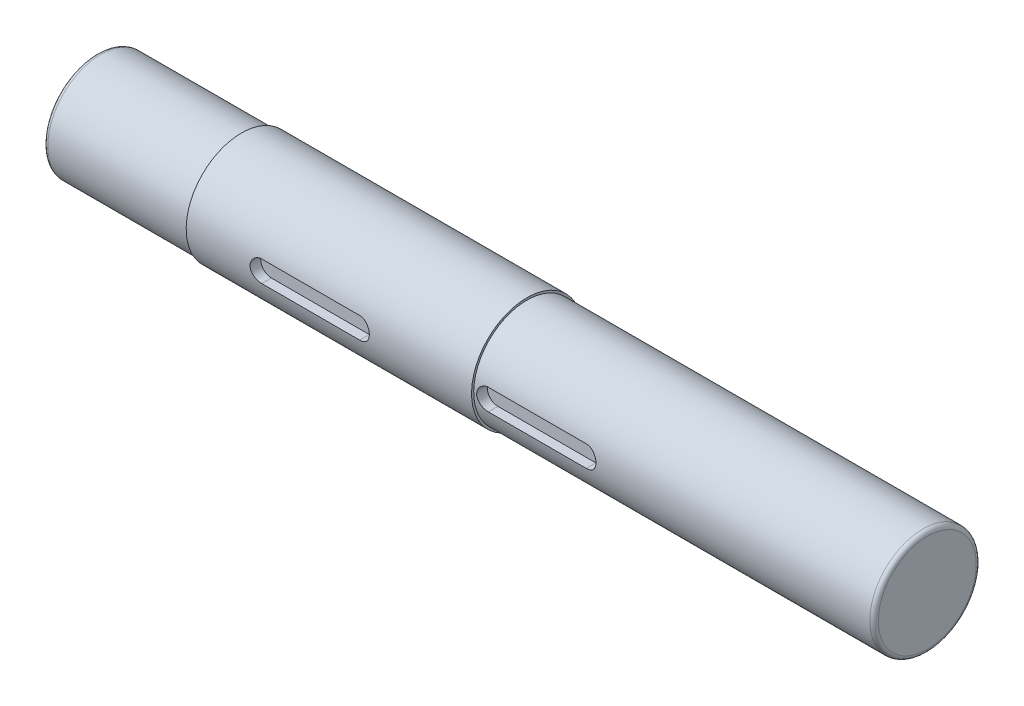
ISO-10303-21;
HEADER;
FILE_DESCRIPTION(('STEP AP214'),'2;1');
FILE_NAME('part.step','',(''),(''),'','','');
FILE_SCHEMA(('AUTOMOTIVE_DESIGN { 1 0 10303 214 1 1 1 1 }'));
ENDSEC;
DATA;
#1=APPLICATION_CONTEXT('core data for automotive mechanical design processes');
#2=APPLICATION_PROTOCOL_DEFINITION('international standard','automotive_design',2000,#1);
#3=PRODUCT_CONTEXT('',#1,'mechanical');
#4=PRODUCT('Part','Part','',(#3));
#5=PRODUCT_RELATED_PRODUCT_CATEGORY('part','',(#4));
#6=PRODUCT_DEFINITION_FORMATION('','',#4);
#7=PRODUCT_DEFINITION_CONTEXT('part definition',#1,'design');
#8=PRODUCT_DEFINITION('design','',#6,#7);
#9=PRODUCT_DEFINITION_SHAPE('','',#8);
#10=(LENGTH_UNIT() NAMED_UNIT(*) SI_UNIT(.MILLI.,.METRE.));
#11=(NAMED_UNIT(*) PLANE_ANGLE_UNIT() SI_UNIT($,.RADIAN.));
#12=(NAMED_UNIT(*) SI_UNIT($,.STERADIAN.) SOLID_ANGLE_UNIT());
#13=UNCERTAINTY_MEASURE_WITH_UNIT(LENGTH_MEASURE(1.E-05),#10,'distance_accuracy_value','');
#14=(GEOMETRIC_REPRESENTATION_CONTEXT(3) GLOBAL_UNCERTAINTY_ASSIGNED_CONTEXT((#13)) GLOBAL_UNIT_ASSIGNED_CONTEXT((#10,
#11,#12)) REPRESENTATION_CONTEXT('',''));
#15=CARTESIAN_POINT('',(0.,0.,0.));
#16=DIRECTION('',(0.,0.,1.));
#17=DIRECTION('',(1.,0.,0.));
#18=AXIS2_PLACEMENT_3D('',#15,#16,#17);
#19=CARTESIAN_POINT('',(16.7770559989917,0.,0.));
#20=DIRECTION('',(1.,0.,0.));
#21=DIRECTION('',(0.,1.,0.));
#22=AXIS2_PLACEMENT_3D('',#19,#20,#21);
#23=PLANE('',#22);
#24=CARTESIAN_POINT('',(16.7770559989917,0.,0.));
#25=DIRECTION('',(1.,0.,0.));
#26=DIRECTION('',(0.,1.,0.));
#27=AXIS2_PLACEMENT_3D('',#24,#25,#26);
#28=CIRCLE('',#27,11.5);
#29=CARTESIAN_POINT('',(16.7770559989917,11.5,0.));
#30=VERTEX_POINT('',#29);
#31=EDGE_CURVE('E79',#30,#30,#28,.F.);
#32=ORIENTED_EDGE('',*,*,#31,.T.);
#33=EDGE_LOOP('',(#32));
#34=FACE_BOUND('',#33,.T.);
#35=ADVANCED_FACE('F70',(#34),#23,.F.);
#36=CARTESIAN_POINT('',(0.,0.,0.));
#37=DIRECTION('',(-1.,0.,0.));
#38=DIRECTION('',(0.,-1.,0.));
#39=AXIS2_PLACEMENT_3D('',#36,#37,#38);
#40=CYLINDRICAL_SURFACE('',#39,12.5);
#41=CARTESIAN_POINT('',(17.7770559989917,0.,0.));
#42=DIRECTION('',(1.,0.,0.));
#43=DIRECTION('',(0.,1.,0.));
#44=AXIS2_PLACEMENT_3D('',#41,#42,#43);
#45=CIRCLE('',#44,12.5);
#46=CARTESIAN_POINT('',(17.7770559989917,12.5,0.));
#47=VERTEX_POINT('',#46);
#48=EDGE_CURVE('E12',#47,#47,#45,.T.);
#49=ORIENTED_EDGE('',*,*,#48,.T.);
#50=EDGE_LOOP('',(#49));
#51=FACE_BOUND('',#50,.T.);
#52=CARTESIAN_POINT('',(50.7770559989917,0.,0.));
#53=DIRECTION('',(-1.,0.,0.));
#54=DIRECTION('',(0.,-1.,0.));
#55=AXIS2_PLACEMENT_3D('',#52,#53,#54);
#56=CIRCLE('',#55,12.5);
#57=CARTESIAN_POINT('',(50.7770559989917,-12.5,0.));
#58=VERTEX_POINT('',#57);
#59=EDGE_CURVE('E218',#58,#58,#56,.T.);
#60=ORIENTED_EDGE('',*,*,#59,.T.);
#61=EDGE_LOOP('',(#60));
#62=FACE_BOUND('',#61,.T.);
#63=ADVANCED_FACE('F268',(#51,#62),#40,.T.);
#64=CARTESIAN_POINT('',(50.7770559989917,12.5,0.));
#65=DIRECTION('',(1.,0.,0.));
#66=DIRECTION('',(0.,1.,0.));
#67=AXIS2_PLACEMENT_3D('',#64,#65,#66);
#68=PLANE('',#67);
#69=ORIENTED_EDGE('',*,*,#59,.F.);
#70=EDGE_LOOP('',(#69));
#71=FACE_BOUND('',#70,.T.);
#72=CARTESIAN_POINT('',(50.7770559989917,0.,0.));
#73=DIRECTION('',(-1.,0.,0.));
#74=DIRECTION('',(0.,-1.,0.));
#75=AXIS2_PLACEMENT_3D('',#72,#73,#74);
#76=CIRCLE('',#75,13.);
#77=CARTESIAN_POINT('',(50.7770559989917,-13.,0.));
#78=VERTEX_POINT('',#77);
#79=EDGE_CURVE('E214',#78,#78,#76,.T.);
#80=ORIENTED_EDGE('',*,*,#79,.T.);
#81=EDGE_LOOP('',(#80));
#82=FACE_BOUND('',#81,.T.);
#83=ADVANCED_FACE('F274',(#71,#82),#68,.F.);
#84=CARTESIAN_POINT('',(0.,0.,0.));
#85=DIRECTION('',(-1.,0.,0.));
#86=DIRECTION('',(0.,-1.,0.));
#87=AXIS2_PLACEMENT_3D('',#84,#85,#86);
#88=CYLINDRICAL_SURFACE('',#87,13.);
#89=DIRECTION('',(-1.,0.,0.));
#90=VECTOR('',#89,1.);
#91=CARTESIAN_POINT('',(0.,2.5,12.7573508221731));
#92=LINE('',#91,#90);
#93=CARTESIAN_POINT('',(68.2770559989917,2.5,12.7573508221731));
#94=VERTEX_POINT('',#93);
#95=CARTESIAN_POINT('',(91.2770559989917,2.5,12.7573508221731));
#96=VERTEX_POINT('',#95);
#97=EDGE_CURVE('E294',#94,#96,#92,.F.);
#98=ORIENTED_EDGE('',*,*,#97,.T.);
#99=CARTESIAN_POINT('',(91.2770559989917,2.5,12.7573508221731));
#100=CARTESIAN_POINT('',(91.3466769540135,2.50000749134501,12.7573450464474));
#101=CARTESIAN_POINT('',(91.4162938125508,2.49709183508114,12.7579206121242));
#102=CARTESIAN_POINT('',(91.555016449216,2.4854723251681,12.7601916690976));
#103=CARTESIAN_POINT('',(91.6241222865984,2.47676915358704,12.7618870284246));
#104=CARTESIAN_POINT('',(91.7612365657222,2.45364955850212,12.7663516758934));
#105=CARTESIAN_POINT('',(91.8292464610685,2.43924148665357,12.7691193940352));
#106=CARTESIAN_POINT('',(91.9637703608093,2.40483890464578,12.7756429882));
#107=CARTESIAN_POINT('',(92.0302843609908,2.38484437875512,12.7793988670055));
#108=CARTESIAN_POINT('',(92.2269017806371,2.31667689058028,12.7919965449688));
#109=CARTESIAN_POINT('',(92.3541853084039,2.26030223128796,12.802172039726));
#110=CARTESIAN_POINT('',(92.5974318707107,2.12740433500017,12.8249236030346));
#111=CARTESIAN_POINT('',(92.7133939832622,2.05087945889333,12.8374998668528));
#112=CARTESIAN_POINT('',(92.9322867372409,1.87877766486924,12.8638190772355));
#113=CARTESIAN_POINT('',(93.0350504567699,1.78298987237361,12.8775738735689));
#114=CARTESIAN_POINT('',(93.2231575913683,1.57553248923086,12.9045968562288));
#115=CARTESIAN_POINT('',(93.3084983155733,1.46386044988071,12.9178649671309));
#116=CARTESIAN_POINT('',(93.4599810981946,1.22669868693375,12.9425467094166));
#117=CARTESIAN_POINT('',(93.5259637862703,1.10110538216146,12.9539446237223));
#118=CARTESIAN_POINT('',(93.6358249589293,0.840366995812635,12.9734672220131));
#119=CARTESIAN_POINT('',(93.6797065700072,0.705223268358008,12.9815923689427));
#120=CARTESIAN_POINT('',(93.7436030003435,0.430962451712162,12.9935704801327));
#121=CARTESIAN_POINT('',(93.7639022930258,0.291913898081878,12.9974743252764));
#122=CARTESIAN_POINT('',(93.7809446641174,0.012330358804893,13.0007455259619));
#123=CARTESIAN_POINT('',(93.7776892985411,-0.128204528042612,13.0001131811632));
#124=CARTESIAN_POINT('',(93.7479311845977,-0.404812069674786,12.9944227132966));
#125=CARTESIAN_POINT('',(93.7217353883,-0.540919123573043,12.9894230291797));
#126=CARTESIAN_POINT('',(93.647326193584,-0.806767970914472,12.9756253916883));
#127=CARTESIAN_POINT('',(93.5991121182931,-0.936509568538794,12.9668273215464));
#128=CARTESIAN_POINT('',(93.4817447690456,-1.18683246539346,12.9463241531854));
#129=CARTESIAN_POINT('',(93.4124693724888,-1.30735506625151,12.9346021740292));
#130=CARTESIAN_POINT('',(93.2550381046637,-1.53517508001959,12.9095465327852));
#131=CARTESIAN_POINT('',(93.1668808485495,-1.642471521978,12.8962127525149));
#132=CARTESIAN_POINT('',(92.9725128779841,-1.84260520934155,12.8691563183537));
#133=CARTESIAN_POINT('',(92.8660357387036,-1.93518347788428,12.8554308562756));
#134=CARTESIAN_POINT('',(92.6388955797498,-2.10123391086704,12.8293376783619));
#135=CARTESIAN_POINT('',(92.51822862109,-2.17470075185362,12.8169703413827));
#136=CARTESIAN_POINT('',(92.2657623190446,-2.30052439071487,12.7949870228682));
#137=CARTESIAN_POINT('',(92.1339367746156,-2.35282973848041,12.785377763339));
#138=CARTESIAN_POINT('',(91.8632285113087,-2.43440300782316,12.7700991944559));
#139=CARTESIAN_POINT('',(91.7243566418719,-2.46370526675116,12.7644240140795));
#140=CARTESIAN_POINT('',(91.5331655107525,-2.48738033750851,12.7598182513312));
#141=CARTESIAN_POINT('',(91.4820176040968,-2.49211443610511,12.758893934206));
#142=CARTESIAN_POINT('',(91.3796060961588,-2.4984202631732,12.7576607600124));
#143=CARTESIAN_POINT('',(91.3283428339379,-2.49999729472618,12.7573508708674));
#144=CARTESIAN_POINT('',(91.2770559989917,-2.5,12.7573508221731));
#145=B_SPLINE_CURVE_WITH_KNOTS('',3,(#99,#100,#101,#102,#103,#104,#105,#106,#107,#108,#109,#110,
#111,#112,#113,#114,#115,#116,#117,#118,#119,#120,#121,#122,#123,#124,#125,#126,#127,#128,#129,
#130,#131,#132,#133,#134,#135,#136,#137,#138,#139,#140,#141,#142,#143,#144),.UNSPECIFIED.,.F.,
.F.,(4,2,2,2,2,2,2,2,2,2,2,2,2,2,2,2,2,2,2,2,2,2,4),(0.,0.208792287301753,0.417559972452479,
0.62602315669972,0.834486927984087,1.25109972457769,1.667746420848,2.08923027242979,
2.51077917019385,2.93570700224004,3.36057470563139,3.78026219322586,4.19992195662793,
4.61405085494291,5.02819248501802,5.44478282994125,5.86140373917902,6.28469435084244,
6.70810274338996,7.13253447358112,7.55633143158242,7.71037872823123,7.86416704617294),.UNSPECIFIED.);
#146=CARTESIAN_POINT('',(91.2770559989917,-2.5,12.7573508221731));
#147=VERTEX_POINT('',#146);
#148=EDGE_CURVE('E316',#96,#147,#145,.T.);
#149=ORIENTED_EDGE('',*,*,#148,.T.);
#150=DIRECTION('',(-1.,0.,0.));
#151=VECTOR('',#150,1.);
#152=CARTESIAN_POINT('',(0.,-2.5,12.7573508221731));
#153=LINE('',#152,#151);
#154=CARTESIAN_POINT('',(68.2770559989917,-2.5,12.7573508221731));
#155=VERTEX_POINT('',#154);
#156=EDGE_CURVE('E300',#147,#155,#153,.T.);
#157=ORIENTED_EDGE('',*,*,#156,.T.);
#158=CARTESIAN_POINT('',(68.2770559989917,-2.5,12.7573508221731));
#159=CARTESIAN_POINT('',(68.2074350439699,-2.50000749134501,12.7573450464474));
#160=CARTESIAN_POINT('',(68.1378181854326,-2.49709183508114,12.7579206121242));
#161=CARTESIAN_POINT('',(67.9990955487674,-2.4854723251681,12.7601916690976));
#162=CARTESIAN_POINT('',(67.929989711385,-2.47676915358704,12.7618870284246));
#163=CARTESIAN_POINT('',(67.7928754322612,-2.45364955850212,12.7663516758934));
#164=CARTESIAN_POINT('',(67.7248655369148,-2.43924148665356,12.7691193940352));
#165=CARTESIAN_POINT('',(67.590341637174,-2.40483890464577,12.7756429882));
#166=CARTESIAN_POINT('',(67.5238276369926,-2.38484437875512,12.7793988670055));
#167=CARTESIAN_POINT('',(67.3272102173463,-2.31667689058028,12.7919965449688));
#168=CARTESIAN_POINT('',(67.1999266895794,-2.26030223128796,12.802172039726));
#169=CARTESIAN_POINT('',(66.9566801272727,-2.12740433500017,12.8249236030346));
#170=CARTESIAN_POINT('',(66.8407180147211,-2.05087945889333,12.8374998668528));
#171=CARTESIAN_POINT('',(66.6218252607425,-1.87877766486924,12.8638190772355));
#172=CARTESIAN_POINT('',(66.5190615412135,-1.78298987237361,12.8775738735689));
#173=CARTESIAN_POINT('',(66.3309544066151,-1.57553248923086,12.9045968562288));
#174=CARTESIAN_POINT('',(66.2456136824101,-1.46386044988071,12.9178649671309));
#175=CARTESIAN_POINT('',(66.0941308997888,-1.22669868693375,12.9425467094166));
#176=CARTESIAN_POINT('',(66.0281482117131,-1.10110538216147,12.9539446237223));
#177=CARTESIAN_POINT('',(65.9182870390541,-0.840366995812639,12.9734672220131));
#178=CARTESIAN_POINT('',(65.8744054279762,-0.70522326835801,12.9815923689427));
#179=CARTESIAN_POINT('',(65.8105089976399,-0.430962451712163,12.9935704801327));
#180=CARTESIAN_POINT('',(65.7902097049576,-0.291913898081878,12.9974743252764));
#181=CARTESIAN_POINT('',(65.773167333866,-0.0123303588048935,13.0007455259619));
#182=CARTESIAN_POINT('',(65.7764226994423,0.128204528042612,13.0001131811632));
#183=CARTESIAN_POINT('',(65.8061808133857,0.404812069674785,12.9944227132966));
#184=CARTESIAN_POINT('',(65.8323766096834,0.540919123573042,12.9894230291797));
#185=CARTESIAN_POINT('',(65.9067858043994,0.806767970914472,12.9756253916883));
#186=CARTESIAN_POINT('',(65.9549998796903,0.936509568538795,12.9668273215464));
#187=CARTESIAN_POINT('',(66.0723672289377,1.18683246539346,12.9463241531854));
#188=CARTESIAN_POINT('',(66.1416426254946,1.30735506625151,12.9346021740292));
#189=CARTESIAN_POINT('',(66.2990738933197,1.53517508001959,12.9095465327852));
#190=CARTESIAN_POINT('',(66.3872311494338,1.642471521978,12.8962127525149));
#191=CARTESIAN_POINT('',(66.5815991199993,1.84260520934154,12.8691563183537));
#192=CARTESIAN_POINT('',(66.6880762592798,1.93518347788427,12.8554308562756));
#193=CARTESIAN_POINT('',(66.9152164182336,2.10123391086703,12.8293376783619));
#194=CARTESIAN_POINT('',(67.0358833768934,2.17470075185362,12.8169703413827));
#195=CARTESIAN_POINT('',(67.2883496789388,2.30052439071487,12.7949870228682));
#196=CARTESIAN_POINT('',(67.4201752233678,2.35282973848041,12.7853777633391));
#197=CARTESIAN_POINT('',(67.6908834866747,2.43440300782316,12.7700991944559));
#198=CARTESIAN_POINT('',(67.8297553561115,2.46370526675116,12.7644240140795));
#199=CARTESIAN_POINT('',(68.0209464872309,2.48738033750851,12.7598182513312));
#200=CARTESIAN_POINT('',(68.0720943938865,2.49211443610511,12.758893934206));
#201=CARTESIAN_POINT('',(68.1745059018246,2.4984202631732,12.7576607600124));
#202=CARTESIAN_POINT('',(68.2257691640455,2.49999729472618,12.7573508708674));
#203=CARTESIAN_POINT('',(68.2770559989917,2.5,12.7573508221731));
#204=B_SPLINE_CURVE_WITH_KNOTS('',3,(#158,#159,#160,#161,#162,#163,#164,#165,#166,#167,#168,
#169,#170,#171,#172,#173,#174,#175,#176,#177,#178,#179,#180,#181,#182,#183,#184,#185,#186,#187,
#188,#189,#190,#191,#192,#193,#194,#195,#196,#197,#198,#199,#200,#201,#202,#203),.UNSPECIFIED.,
.F.,.F.,(4,2,2,2,2,2,2,2,2,2,2,2,2,2,2,2,2,2,2,2,2,2,4),(0.,0.208792287301753,0.417559972452479,
0.626023156699735,0.834486927984087,1.25109972457769,1.667746420848,2.08923027242979,
2.51077917019385,2.93570700224004,3.36057470563139,3.78026219322587,4.19992195662793,
4.61405085494291,5.02819248501802,5.44478282994127,5.86140373917903,6.28469435084243,
6.70810274338996,7.13253447358111,7.55633143158242,7.71037872823123,7.86416704617294),.UNSPECIFIED.);
#205=EDGE_CURVE('E86',#155,#94,#204,.T.);
#206=ORIENTED_EDGE('',*,*,#205,.T.);
#207=EDGE_LOOP('',(#98,#149,#157,#206));
#208=FACE_BOUND('',#207,.T.);
#209=ORIENTED_EDGE('',*,*,#79,.F.);
#210=EDGE_LOOP('',(#209));
#211=FACE_BOUND('',#210,.T.);
#212=CARTESIAN_POINT('',(117.777055998992,0.,0.));
#213=DIRECTION('',(-1.,0.,0.));
#214=DIRECTION('',(0.,-1.,0.));
#215=AXIS2_PLACEMENT_3D('',#212,#213,#214);
#216=CIRCLE('',#215,13.);
#217=CARTESIAN_POINT('',(117.777055998992,-13.,0.));
#218=VERTEX_POINT('',#217);
#219=EDGE_CURVE('E210',#218,#218,#216,.T.);
#220=ORIENTED_EDGE('',*,*,#219,.T.);
#221=EDGE_LOOP('',(#220));
#222=FACE_BOUND('',#221,.T.);
#223=ADVANCED_FACE('F323',(#208,#211,#222),#88,.T.);
#224=CARTESIAN_POINT('',(117.777055998992,13.,0.));
#225=DIRECTION('',(-1.,0.,0.));
#226=DIRECTION('',(0.,-1.,0.));
#227=AXIS2_PLACEMENT_3D('',#224,#225,#226);
#228=PLANE('',#227);
#229=ORIENTED_EDGE('',*,*,#219,.F.);
#230=EDGE_LOOP('',(#229));
#231=FACE_BOUND('',#230,.T.);
#232=CARTESIAN_POINT('',(117.777055998992,0.,0.));
#233=DIRECTION('',(-1.,0.,0.));
#234=DIRECTION('',(0.,-1.,0.));
#235=AXIS2_PLACEMENT_3D('',#232,#233,#234);
#236=CIRCLE('',#235,12.5);
#237=CARTESIAN_POINT('',(117.777055998992,-12.5,0.));
#238=VERTEX_POINT('',#237);
#239=EDGE_CURVE('E196',#238,#238,#236,.T.);
#240=ORIENTED_EDGE('',*,*,#239,.T.);
#241=EDGE_LOOP('',(#240));
#242=FACE_BOUND('',#241,.T.);
#243=ADVANCED_FACE('F264',(#231,#242),#228,.F.);
#244=CARTESIAN_POINT('',(0.,0.,0.));
#245=DIRECTION('',(-1.,0.,0.));
#246=DIRECTION('',(0.,-1.,0.));
#247=AXIS2_PLACEMENT_3D('',#244,#245,#246);
#248=CYLINDRICAL_SURFACE('',#247,12.5);
#249=CARTESIAN_POINT('',(210.777055998992,0.,0.));
#250=DIRECTION('',(-1.,0.,0.));
#251=DIRECTION('',(0.,-1.,0.));
#252=AXIS2_PLACEMENT_3D('',#249,#250,#251);
#253=CIRCLE('',#252,12.5);
#254=CARTESIAN_POINT('',(210.777055998992,-12.5,0.));
#255=VERTEX_POINT('',#254);
#256=EDGE_CURVE('E292',#255,#255,#253,.T.);
#257=ORIENTED_EDGE('',*,*,#256,.T.);
#258=EDGE_LOOP('',(#257));
#259=FACE_BOUND('',#258,.T.);
#260=DIRECTION('',(-1.,0.,0.));
#261=VECTOR('',#260,1.);
#262=CARTESIAN_POINT('',(0.,2.5,12.2474487139159));
#263=LINE('',#262,#261);
#264=CARTESIAN_POINT('',(120.977055998992,2.5,12.2474487139159));
#265=VERTEX_POINT('',#264);
#266=CARTESIAN_POINT('',(143.977055998992,2.5,12.2474487139159));
#267=VERTEX_POINT('',#266);
#268=EDGE_CURVE('E341',#265,#267,#263,.F.);
#269=ORIENTED_EDGE('',*,*,#268,.T.);
#270=CARTESIAN_POINT('',(143.977055998992,2.5,12.2474487139159));
#271=CARTESIAN_POINT('',(144.04662000614,2.50000755272741,12.2474426870481));
#272=CARTESIAN_POINT('',(144.116179840876,2.4970965955306,12.2480412546813));
#273=CARTESIAN_POINT('',(144.254787748966,2.48549624534854,12.2504029528616));
#274=CARTESIAN_POINT('',(144.323835884559,2.47680756718743,12.2521659393457));
#275=CARTESIAN_POINT('',(144.460830245644,2.45372788482215,12.25680833904));
#276=CARTESIAN_POINT('',(144.528777986405,2.43934556755124,12.259686051341));
#277=CARTESIAN_POINT('',(144.663178009578,2.40500601307057,12.2664685140532));
#278=CARTESIAN_POINT('',(144.729630285883,2.3850487531024,12.2703732686573));
#279=CARTESIAN_POINT('',(144.926060753671,2.3170127329341,12.2834692504436));
#280=CARTESIAN_POINT('',(145.053221047289,2.26075131705719,12.2940461363477));
#281=CARTESIAN_POINT('',(145.296245484614,2.12812970933266,12.3176934066007));
#282=CARTESIAN_POINT('',(145.412108455837,2.0517674343692,12.3307640493469));
#283=CARTESIAN_POINT('',(145.630948147289,1.87995278838547,12.3581317705241));
#284=CARTESIAN_POINT('',(145.733744709394,1.78427266064759,12.3724421926957));
#285=CARTESIAN_POINT('',(145.92194409269,1.57702607132328,12.4005606698654));
#286=CARTESIAN_POINT('',(146.007344218884,1.46545715284152,12.4143686467546));
#287=CARTESIAN_POINT('',(146.159027709814,1.22840024371411,12.4400702526805));
#288=CARTESIAN_POINT('',(146.225138277006,1.10279959145393,12.4519461799055));
#289=CARTESIAN_POINT('',(146.335245855361,0.842002975760189,12.4722938885067));
#290=CARTESIAN_POINT('',(146.379246137492,0.706808435013489,12.4807661733763));
#291=CARTESIAN_POINT('',(146.443323582061,0.432543529973138,12.4932579438613));
#292=CARTESIAN_POINT('',(146.463707962497,0.293547588516987,12.4973345628875));
#293=CARTESIAN_POINT('',(146.480933457791,0.0140496897960053,12.5007730438039));
#294=CARTESIAN_POINT('',(146.477776295154,-0.126452156532585,12.5001352506414));
#295=CARTESIAN_POINT('',(146.448240495385,-0.402855506346809,12.494260861056));
#296=CARTESIAN_POINT('',(146.422193373512,-0.53879403324702,12.4890899207821));
#297=CARTESIAN_POINT('',(146.348143057269,-0.804330016531247,12.4748043625546));
#298=CARTESIAN_POINT('',(146.300139144879,-0.933927265392428,12.4656896156329));
#299=CARTESIAN_POINT('',(146.183229990059,-1.1840506782429,12.4444322280103));
#300=CARTESIAN_POINT('',(146.114194531625,-1.30451431703058,12.4322708097766));
#301=CARTESIAN_POINT('',(145.957280323352,-1.53226609471823,12.4062612907301));
#302=CARTESIAN_POINT('',(145.869400011896,-1.6395531405533,12.3924130501763));
#303=CARTESIAN_POINT('',(145.675485094914,-1.83986551634352,12.3642759342124));
#304=CARTESIAN_POINT('',(145.569162493809,-1.93261173748931,12.3499835810434));
#305=CARTESIAN_POINT('',(145.342294102773,-2.09902724974938,12.3227926529107));
#306=CARTESIAN_POINT('',(145.221744386077,-2.17269125605402,12.3098944646352));
#307=CARTESIAN_POINT('',(144.969424986626,-2.2989498866117,12.286943251058));
#308=CARTESIAN_POINT('',(144.8376259405,-2.35148719158619,12.2768979874586));
#309=CARTESIAN_POINT('',(144.566909420853,-2.43351774332483,12.2609040265623));
#310=CARTESIAN_POINT('',(144.428002882371,-2.46304531871083,12.2549492282072));
#311=CARTESIAN_POINT('',(144.236163956876,-2.48708234530492,12.2500794297991));
#312=CARTESIAN_POINT('',(144.184420649536,-2.49192813913878,12.2490939967998));
#313=CARTESIAN_POINT('',(144.080811338648,-2.49838291166163,12.2477791846693));
#314=CARTESIAN_POINT('',(144.028945686602,-2.49999730726164,12.2474487076206));
#315=CARTESIAN_POINT('',(143.977055998992,-2.5,12.2474487139159));
#316=B_SPLINE_CURVE_WITH_KNOTS('',3,(#270,#271,#272,#273,#274,#275,#276,#277,#278,#279,#280,
#281,#282,#283,#284,#285,#286,#287,#288,#289,#290,#291,#292,#293,#294,#295,#296,#297,#298,#299,
#300,#301,#302,#303,#304,#305,#306,#307,#308,#309,#310,#311,#312,#313,#314,#315),.UNSPECIFIED.,
.F.,.F.,(4,2,2,2,2,2,2,2,2,2,2,2,2,2,2,2,2,2,2,2,2,2,4),(0.,0.208621275894793,0.417216745803818,
0.625495175236937,0.833774454931095,1.25000691135223,1.66628252025785,2.08778731527754,
2.50935735880446,2.93459542557447,3.35977056463055,3.7793502128709,4.19889916132034,
4.61247011057753,5.02605458519856,5.44225366753896,5.85848725240714,6.2819279577507,
6.7054858097053,7.13018519486866,7.55424974394839,7.71010621722901,7.86570120305832),.UNSPECIFIED.);
#317=CARTESIAN_POINT('',(143.977055998992,-2.5,12.2474487139159));
#318=VERTEX_POINT('',#317);
#319=EDGE_CURVE('E222',#267,#318,#316,.T.);
#320=ORIENTED_EDGE('',*,*,#319,.T.);
#321=DIRECTION('',(-1.,0.,0.));
#322=VECTOR('',#321,1.);
#323=CARTESIAN_POINT('',(0.,-2.5,12.2474487139159));
#324=LINE('',#323,#322);
#325=CARTESIAN_POINT('',(120.977055998992,-2.5,12.2474487139159));
#326=VERTEX_POINT('',#325);
#327=EDGE_CURVE('E338',#318,#326,#324,.T.);
#328=ORIENTED_EDGE('',*,*,#327,.T.);
#329=CARTESIAN_POINT('',(120.977055998992,-2.5,12.2474487139159));
#330=CARTESIAN_POINT('',(120.907491991843,-2.50000755272741,12.2474426870481));
#331=CARTESIAN_POINT('',(120.837932157107,-2.49709659553059,12.2480412546813));
#332=CARTESIAN_POINT('',(120.699324249017,-2.48549624534853,12.2504029528616));
#333=CARTESIAN_POINT('',(120.630276113425,-2.47680756718742,12.2521659393457));
#334=CARTESIAN_POINT('',(120.493281752339,-2.45372788482214,12.25680833904));
#335=CARTESIAN_POINT('',(120.425334011578,-2.43934556755122,12.259686051341));
#336=CARTESIAN_POINT('',(120.290933988405,-2.40500601307055,12.2664685140532));
#337=CARTESIAN_POINT('',(120.2244817121,-2.38504875310239,12.2703732686573));
#338=CARTESIAN_POINT('',(120.028051244313,-2.31701273293409,12.2834692504436));
#339=CARTESIAN_POINT('',(119.900890950695,-2.26075131705718,12.2940461363477));
#340=CARTESIAN_POINT('',(119.65786651337,-2.12812970933264,12.3176934066007));
#341=CARTESIAN_POINT('',(119.542003542147,-2.05176743436919,12.3307640493469));
#342=CARTESIAN_POINT('',(119.323163850695,-1.87995278838545,12.3581317705241));
#343=CARTESIAN_POINT('',(119.220367288589,-1.78427266064757,12.3724421926957));
#344=CARTESIAN_POINT('',(119.032167905293,-1.57702607132325,12.4005606698654));
#345=CARTESIAN_POINT('',(118.946767779099,-1.4654571528415,12.4143686467546));
#346=CARTESIAN_POINT('',(118.79508428817,-1.22840024371409,12.4400702526805));
#347=CARTESIAN_POINT('',(118.728973720978,-1.10279959145391,12.4519461799055));
#348=CARTESIAN_POINT('',(118.618866142622,-0.842002975760166,12.4722938885068));
#349=CARTESIAN_POINT('',(118.574865860491,-0.706808435013475,12.4807661733763));
#350=CARTESIAN_POINT('',(118.510788415922,-0.432543529973129,12.4932579438613));
#351=CARTESIAN_POINT('',(118.490404035486,-0.293547588516975,12.4973345628875));
#352=CARTESIAN_POINT('',(118.473178540192,-0.0140496897959902,12.5007730438039));
#353=CARTESIAN_POINT('',(118.47633570283,0.1264521565326,12.5001352506414));
#354=CARTESIAN_POINT('',(118.505871502598,0.402855506346825,12.494260861056));
#355=CARTESIAN_POINT('',(118.531918624471,0.538794033247037,12.4890899207821));
#356=CARTESIAN_POINT('',(118.605968940714,0.804330016531261,12.4748043625546));
#357=CARTESIAN_POINT('',(118.653972853104,0.933927265392439,12.4656896156329));
#358=CARTESIAN_POINT('',(118.770882007924,1.18405067824291,12.4444322280103));
#359=CARTESIAN_POINT('',(118.839917466359,1.30451431703059,12.4322708097766));
#360=CARTESIAN_POINT('',(118.996831674631,1.53226609471824,12.4062612907301));
#361=CARTESIAN_POINT('',(119.084711986087,1.63955314055332,12.3924130501763));
#362=CARTESIAN_POINT('',(119.278626903069,1.83986551634353,12.3642759342124));
#363=CARTESIAN_POINT('',(119.384949504174,1.93261173748933,12.3499835810434));
#364=CARTESIAN_POINT('',(119.61181789521,2.0990272497494,12.3227926529107));
#365=CARTESIAN_POINT('',(119.732367611906,2.17269125605403,12.3098944646352));
#366=CARTESIAN_POINT('',(119.984687011358,2.29894988661171,12.286943251058));
#367=CARTESIAN_POINT('',(120.116486057483,2.3514871915862,12.2768979874586));
#368=CARTESIAN_POINT('',(120.387202577131,2.43351774332484,12.2609040265623));
#369=CARTESIAN_POINT('',(120.526109115612,2.46304531871083,12.2549492282072));
#370=CARTESIAN_POINT('',(120.717948041108,2.48708234530491,12.2500794297991));
#371=CARTESIAN_POINT('',(120.769691348448,2.49192813913878,12.2490939967998));
#372=CARTESIAN_POINT('',(120.873300659335,2.49838291166163,12.2477791846693));
#373=CARTESIAN_POINT('',(120.925166311381,2.49999730726164,12.2474487076206));
#374=CARTESIAN_POINT('',(120.977055998992,2.5,12.2474487139159));
#375=B_SPLINE_CURVE_WITH_KNOTS('',3,(#329,#330,#331,#332,#333,#334,#335,#336,#337,#338,#339,
#340,#341,#342,#343,#344,#345,#346,#347,#348,#349,#350,#351,#352,#353,#354,#355,#356,#357,#358,
#359,#360,#361,#362,#363,#364,#365,#366,#367,#368,#369,#370,#371,#372,#373,#374),.UNSPECIFIED.,
.F.,.F.,(4,2,2,2,2,2,2,2,2,2,2,2,2,2,2,2,2,2,2,2,2,2,4),(0.,0.20862127589482,0.41721674580386,
0.625495175237009,0.83377445493111,1.25000691135226,1.66628252025788,2.08778731527757,
2.50935735880448,2.9345954255745,3.35977056463055,3.77935021287091,4.19889916132036,
4.61247011057754,5.02605458519858,5.44225366753897,5.85848725240717,6.28192795775072,
6.70548580970531,7.13018519486867,7.55424974394838,7.71010621722896,7.86570120305829),.UNSPECIFIED.);
#376=EDGE_CURVE('E94',#326,#265,#375,.T.);
#377=ORIENTED_EDGE('',*,*,#376,.T.);
#378=EDGE_LOOP('',(#269,#320,#328,#377));
#379=FACE_BOUND('',#378,.T.);
#380=ORIENTED_EDGE('',*,*,#239,.F.);
#381=EDGE_LOOP('',(#380));
#382=FACE_BOUND('',#381,.T.);
#383=ADVANCED_FACE('F238',(#259,#379,#382),#248,.T.);
#384=CARTESIAN_POINT('',(211.777055998992,12.5,0.));
#385=DIRECTION('',(-1.,0.,0.));
#386=DIRECTION('',(0.,-1.,0.));
#387=AXIS2_PLACEMENT_3D('',#384,#385,#386);
#388=PLANE('',#387);
#389=CARTESIAN_POINT('',(211.777055998992,0.,0.));
#390=DIRECTION('',(-1.,0.,0.));
#391=DIRECTION('',(0.,-1.,0.));
#392=AXIS2_PLACEMENT_3D('',#389,#390,#391);
#393=CIRCLE('',#392,11.5);
#394=CARTESIAN_POINT('',(211.777055998992,-11.5,0.));
#395=VERTEX_POINT('',#394);
#396=EDGE_CURVE('E289',#395,#395,#393,.F.);
#397=ORIENTED_EDGE('',*,*,#396,.T.);
#398=EDGE_LOOP('',(#397));
#399=FACE_BOUND('',#398,.T.);
#400=ADVANCED_FACE('F257',(#399),#388,.F.);
#401=CARTESIAN_POINT('',(120.977055998992,0.,10.));
#402=DIRECTION('',(0.,0.,1.));
#403=DIRECTION('',(1.,0.,0.));
#404=AXIS2_PLACEMENT_3D('',#401,#402,#403);
#405=CYLINDRICAL_SURFACE('',#404,2.5);
#406=DIRECTION('',(0.,0.,1.));
#407=VECTOR('',#406,1.);
#408=CARTESIAN_POINT('',(120.977055998992,-2.5,10.));
#409=LINE('',#408,#407);
#410=CARTESIAN_POINT('',(120.977055998992,-2.5,10.));
#411=VERTEX_POINT('',#410);
#412=EDGE_CURVE('E192',#411,#326,#409,.T.);
#413=ORIENTED_EDGE('',*,*,#412,.F.);
#414=CARTESIAN_POINT('',(120.977055998992,0.,10.));
#415=DIRECTION('',(0.,0.,1.));
#416=DIRECTION('',(1.,0.,0.));
#417=AXIS2_PLACEMENT_3D('',#414,#415,#416);
#418=CIRCLE('',#417,2.5);
#419=CARTESIAN_POINT('',(120.977055998992,2.5,10.));
#420=VERTEX_POINT('',#419);
#421=EDGE_CURVE('E170',#420,#411,#418,.T.);
#422=ORIENTED_EDGE('',*,*,#421,.F.);
#423=DIRECTION('',(0.,0.,1.));
#424=VECTOR('',#423,1.);
#425=CARTESIAN_POINT('',(120.977055998992,2.5,10.));
#426=LINE('',#425,#424);
#427=EDGE_CURVE('E193',#420,#265,#426,.T.);
#428=ORIENTED_EDGE('',*,*,#427,.T.);
#429=ORIENTED_EDGE('',*,*,#376,.F.);
#430=EDGE_LOOP('',(#413,#422,#428,#429));
#431=FACE_BOUND('',#430,.T.);
#432=ADVANCED_FACE('F254',(#431),#405,.F.);
#433=CARTESIAN_POINT('',(120.977055998992,2.5,10.));
#434=DIRECTION('',(0.,1.,0.));
#435=DIRECTION('',(-1.,0.,0.));
#436=AXIS2_PLACEMENT_3D('',#433,#434,#435);
#437=PLANE('',#436);
#438=ORIENTED_EDGE('',*,*,#427,.F.);
#439=DIRECTION('',(-1.,0.,0.));
#440=VECTOR('',#439,1.);
#441=CARTESIAN_POINT('',(120.977055998992,2.5,10.));
#442=LINE('',#441,#440);
#443=CARTESIAN_POINT('',(143.977055998992,2.5,10.));
#444=VERTEX_POINT('',#443);
#445=EDGE_CURVE('E188',#444,#420,#442,.T.);
#446=ORIENTED_EDGE('',*,*,#445,.F.);
#447=DIRECTION('',(0.,0.,1.));
#448=VECTOR('',#447,1.);
#449=CARTESIAN_POINT('',(143.977055998992,2.5,10.));
#450=LINE('',#449,#448);
#451=EDGE_CURVE('E197',#444,#267,#450,.T.);
#452=ORIENTED_EDGE('',*,*,#451,.T.);
#453=ORIENTED_EDGE('',*,*,#268,.F.);
#454=EDGE_LOOP('',(#438,#446,#452,#453));
#455=FACE_BOUND('',#454,.T.);
#456=ADVANCED_FACE('F248',(#455),#437,.F.);
#457=CARTESIAN_POINT('',(143.977055998992,0.,10.));
#458=DIRECTION('',(0.,0.,1.));
#459=DIRECTION('',(1.,0.,0.));
#460=AXIS2_PLACEMENT_3D('',#457,#458,#459);
#461=CYLINDRICAL_SURFACE('',#460,2.5);
#462=ORIENTED_EDGE('',*,*,#451,.F.);
#463=CARTESIAN_POINT('',(143.977055998992,0.,10.));
#464=DIRECTION('',(0.,0.,1.));
#465=DIRECTION('',(1.,0.,0.));
#466=AXIS2_PLACEMENT_3D('',#463,#464,#465);
#467=CIRCLE('',#466,2.5);
#468=CARTESIAN_POINT('',(143.977055998992,-2.5,10.));
#469=VERTEX_POINT('',#468);
#470=EDGE_CURVE('E184',#469,#444,#467,.T.);
#471=ORIENTED_EDGE('',*,*,#470,.F.);
#472=DIRECTION('',(0.,0.,1.));
#473=VECTOR('',#472,1.);
#474=CARTESIAN_POINT('',(143.977055998992,-2.5,10.));
#475=LINE('',#474,#473);
#476=EDGE_CURVE('E201',#469,#318,#475,.T.);
#477=ORIENTED_EDGE('',*,*,#476,.T.);
#478=ORIENTED_EDGE('',*,*,#319,.F.);
#479=EDGE_LOOP('',(#462,#471,#477,#478));
#480=FACE_BOUND('',#479,.T.);
#481=ADVANCED_FACE('F242',(#480),#461,.F.);
#482=CARTESIAN_POINT('',(120.977055998992,-2.5,10.));
#483=DIRECTION('',(0.,-1.,0.));
#484=DIRECTION('',(1.,0.,0.));
#485=AXIS2_PLACEMENT_3D('',#482,#483,#484);
#486=PLANE('',#485);
#487=ORIENTED_EDGE('',*,*,#476,.F.);
#488=DIRECTION('',(1.,0.,0.));
#489=VECTOR('',#488,1.);
#490=CARTESIAN_POINT('',(120.977055998992,-2.5,10.));
#491=LINE('',#490,#489);
#492=EDGE_CURVE('E180',#411,#469,#491,.T.);
#493=ORIENTED_EDGE('',*,*,#492,.F.);
#494=ORIENTED_EDGE('',*,*,#412,.T.);
#495=ORIENTED_EDGE('',*,*,#327,.F.);
#496=EDGE_LOOP('',(#487,#493,#494,#495));
#497=FACE_BOUND('',#496,.T.);
#498=ADVANCED_FACE('F247',(#497),#486,.F.);
#499=CARTESIAN_POINT('',(120.977055998992,0.,10.));
#500=DIRECTION('',(0.,0.,1.));
#501=DIRECTION('',(1.,0.,0.));
#502=AXIS2_PLACEMENT_3D('',#499,#500,#501);
#503=PLANE('',#502);
#504=ORIENTED_EDGE('',*,*,#421,.T.);
#505=ORIENTED_EDGE('',*,*,#492,.T.);
#506=ORIENTED_EDGE('',*,*,#470,.T.);
#507=ORIENTED_EDGE('',*,*,#445,.T.);
#508=EDGE_LOOP('',(#504,#505,#506,#507));
#509=FACE_BOUND('',#508,.T.);
#510=ADVANCED_FACE('F252',(#509),#503,.T.);
#511=CARTESIAN_POINT('',(68.2770559989917,0.,10.5));
#512=DIRECTION('',(0.,0.,1.));
#513=DIRECTION('',(1.,0.,0.));
#514=AXIS2_PLACEMENT_3D('',#511,#512,#513);
#515=CYLINDRICAL_SURFACE('',#514,2.5);
#516=DIRECTION('',(0.,0.,1.));
#517=VECTOR('',#516,1.);
#518=CARTESIAN_POINT('',(68.2770559989917,-2.5,10.5));
#519=LINE('',#518,#517);
#520=CARTESIAN_POINT('',(68.2770559989917,-2.5,10.5));
#521=VERTEX_POINT('',#520);
#522=EDGE_CURVE('E136',#521,#155,#519,.T.);
#523=ORIENTED_EDGE('',*,*,#522,.F.);
#524=CARTESIAN_POINT('',(68.2770559989917,0.,10.5));
#525=DIRECTION('',(0.,0.,1.));
#526=DIRECTION('',(1.,0.,0.));
#527=AXIS2_PLACEMENT_3D('',#524,#525,#526);
#528=CIRCLE('',#527,2.5);
#529=CARTESIAN_POINT('',(68.2770559989917,2.5,10.5));
#530=VERTEX_POINT('',#529);
#531=EDGE_CURVE('E140',#530,#521,#528,.T.);
#532=ORIENTED_EDGE('',*,*,#531,.F.);
#533=DIRECTION('',(0.,0.,1.));
#534=VECTOR('',#533,1.);
#535=CARTESIAN_POINT('',(68.2770559989917,2.5,10.5));
#536=LINE('',#535,#534);
#537=EDGE_CURVE('E167',#530,#94,#536,.T.);
#538=ORIENTED_EDGE('',*,*,#537,.T.);
#539=ORIENTED_EDGE('',*,*,#205,.F.);
#540=EDGE_LOOP('',(#523,#532,#538,#539));
#541=FACE_BOUND('',#540,.T.);
#542=ADVANCED_FACE('F138',(#541),#515,.F.);
#543=CARTESIAN_POINT('',(68.2770559989917,2.5,10.5));
#544=DIRECTION('',(0.,1.,0.));
#545=DIRECTION('',(0.,0.,1.));
#546=AXIS2_PLACEMENT_3D('',#543,#544,#545);
#547=PLANE('',#546);
#548=ORIENTED_EDGE('',*,*,#537,.F.);
#549=DIRECTION('',(-1.,0.,0.));
#550=VECTOR('',#549,1.);
#551=CARTESIAN_POINT('',(68.2770559989917,2.5,10.5));
#552=LINE('',#551,#550);
#553=CARTESIAN_POINT('',(91.2770559989917,2.5,10.5));
#554=VERTEX_POINT('',#553);
#555=EDGE_CURVE('E146',#554,#530,#552,.T.);
#556=ORIENTED_EDGE('',*,*,#555,.F.);
#557=DIRECTION('',(0.,0.,1.));
#558=VECTOR('',#557,1.);
#559=CARTESIAN_POINT('',(91.2770559989917,2.5,10.5));
#560=LINE('',#559,#558);
#561=EDGE_CURVE('E171',#554,#96,#560,.T.);
#562=ORIENTED_EDGE('',*,*,#561,.T.);
#563=ORIENTED_EDGE('',*,*,#97,.F.);
#564=EDGE_LOOP('',(#548,#556,#562,#563));
#565=FACE_BOUND('',#564,.T.);
#566=ADVANCED_FACE('F328',(#565),#547,.F.);
#567=CARTESIAN_POINT('',(91.2770559989917,0.,10.5));
#568=DIRECTION('',(0.,0.,1.));
#569=DIRECTION('',(1.,0.,0.));
#570=AXIS2_PLACEMENT_3D('',#567,#568,#569);
#571=CYLINDRICAL_SURFACE('',#570,2.5);
#572=ORIENTED_EDGE('',*,*,#561,.F.);
#573=CARTESIAN_POINT('',(91.2770559989917,0.,10.5));
#574=DIRECTION('',(0.,0.,1.));
#575=DIRECTION('',(1.,0.,0.));
#576=AXIS2_PLACEMENT_3D('',#573,#574,#575);
#577=CIRCLE('',#576,2.5);
#578=CARTESIAN_POINT('',(91.2770559989917,-2.5,10.5));
#579=VERTEX_POINT('',#578);
#580=EDGE_CURVE('E156',#579,#554,#577,.T.);
#581=ORIENTED_EDGE('',*,*,#580,.F.);
#582=DIRECTION('',(0.,0.,1.));
#583=VECTOR('',#582,1.);
#584=CARTESIAN_POINT('',(91.2770559989917,-2.5,10.5));
#585=LINE('',#584,#583);
#586=EDGE_CURVE('E145',#579,#147,#585,.T.);
#587=ORIENTED_EDGE('',*,*,#586,.T.);
#588=ORIENTED_EDGE('',*,*,#148,.F.);
#589=EDGE_LOOP('',(#572,#581,#587,#588));
#590=FACE_BOUND('',#589,.T.);
#591=ADVANCED_FACE('F369',(#590),#571,.F.);
#592=CARTESIAN_POINT('',(68.2770559989917,-2.5,10.5));
#593=DIRECTION('',(0.,-1.,0.));
#594=DIRECTION('',(0.,0.,-1.));
#595=AXIS2_PLACEMENT_3D('',#592,#593,#594);
#596=PLANE('',#595);
#597=ORIENTED_EDGE('',*,*,#586,.F.);
#598=DIRECTION('',(1.,0.,0.));
#599=VECTOR('',#598,1.);
#600=CARTESIAN_POINT('',(68.2770559989917,-2.5,10.5));
#601=LINE('',#600,#599);
#602=EDGE_CURVE('E149',#521,#579,#601,.T.);
#603=ORIENTED_EDGE('',*,*,#602,.F.);
#604=ORIENTED_EDGE('',*,*,#522,.T.);
#605=ORIENTED_EDGE('',*,*,#156,.F.);
#606=EDGE_LOOP('',(#597,#603,#604,#605));
#607=FACE_BOUND('',#606,.T.);
#608=ADVANCED_FACE('F150',(#607),#596,.F.);
#609=CARTESIAN_POINT('',(68.2770559989917,0.,10.5));
#610=DIRECTION('',(0.,0.,1.));
#611=DIRECTION('',(1.,0.,0.));
#612=AXIS2_PLACEMENT_3D('',#609,#610,#611);
#613=PLANE('',#612);
#614=ORIENTED_EDGE('',*,*,#531,.T.);
#615=ORIENTED_EDGE('',*,*,#602,.T.);
#616=ORIENTED_EDGE('',*,*,#580,.T.);
#617=ORIENTED_EDGE('',*,*,#555,.T.);
#618=EDGE_LOOP('',(#614,#615,#616,#617));
#619=FACE_BOUND('',#618,.T.);
#620=ADVANCED_FACE('F158',(#619),#613,.T.);
#621=CARTESIAN_POINT('',(210.777055998992,0.,0.));
#622=DIRECTION('',(-1.,0.,0.));
#623=DIRECTION('',(0.,-1.,0.));
#624=AXIS2_PLACEMENT_3D('',#621,#622,#623);
#625=TOROIDAL_SURFACE('',#624,11.5,1.);
#626=ORIENTED_EDGE('',*,*,#396,.F.);
#627=EDGE_LOOP('',(#626));
#628=FACE_BOUND('',#627,.T.);
#629=ORIENTED_EDGE('',*,*,#256,.F.);
#630=EDGE_LOOP('',(#629));
#631=FACE_BOUND('',#630,.T.);
#632=ADVANCED_FACE('F279',(#628,#631),#625,.T.);
#633=CARTESIAN_POINT('',(17.7770559989917,0.,0.));
#634=DIRECTION('',(1.,0.,0.));
#635=DIRECTION('',(0.,1.,0.));
#636=AXIS2_PLACEMENT_3D('',#633,#634,#635);
#637=TOROIDAL_SURFACE('',#636,11.5,1.);
#638=ORIENTED_EDGE('',*,*,#48,.F.);
#639=EDGE_LOOP('',(#638));
#640=FACE_BOUND('',#639,.T.);
#641=ORIENTED_EDGE('',*,*,#31,.F.);
#642=EDGE_LOOP('',(#641));
#643=FACE_BOUND('',#642,.T.);
#644=ADVANCED_FACE('F72',(#640,#643),#637,.T.);
#645=CLOSED_SHELL('',(#35,#63,#83,#223,#243,#383,#400,#432,#456,#481,#498,#510,#542,#566,#591,
#608,#620,#632,#644));
#646=MANIFOLD_SOLID_BREP('B2',#645);
#647=ADVANCED_BREP_SHAPE_REPRESENTATION('',(#18,#646),#14);
#648=SHAPE_DEFINITION_REPRESENTATION(#9,#647);
ENDSEC;
END-ISO-10303-21;
